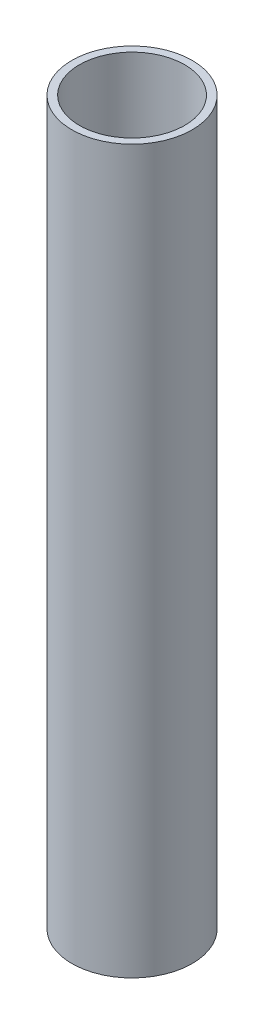
ISO-10303-21;
HEADER;
FILE_DESCRIPTION(('STEP AP214'),'2;1');
FILE_NAME('part.step','',(''),(''),'','','');
FILE_SCHEMA(('AUTOMOTIVE_DESIGN { 1 0 10303 214 1 1 1 1 }'));
ENDSEC;
DATA;
#1=APPLICATION_CONTEXT('core data for automotive mechanical design processes');
#2=APPLICATION_PROTOCOL_DEFINITION('international standard','automotive_design',2000,#1);
#3=PRODUCT_CONTEXT('',#1,'mechanical');
#4=PRODUCT('Part','Part','',(#3));
#5=PRODUCT_RELATED_PRODUCT_CATEGORY('part','',(#4));
#6=PRODUCT_DEFINITION_FORMATION('','',#4);
#7=PRODUCT_DEFINITION_CONTEXT('part definition',#1,'design');
#8=PRODUCT_DEFINITION('design','',#6,#7);
#9=PRODUCT_DEFINITION_SHAPE('','',#8);
#10=(LENGTH_UNIT() NAMED_UNIT(*) SI_UNIT(.MILLI.,.METRE.));
#11=(NAMED_UNIT(*) PLANE_ANGLE_UNIT() SI_UNIT($,.RADIAN.));
#12=(NAMED_UNIT(*) SI_UNIT($,.STERADIAN.) SOLID_ANGLE_UNIT());
#13=UNCERTAINTY_MEASURE_WITH_UNIT(LENGTH_MEASURE(1.E-05),#10,'distance_accuracy_value','');
#14=(GEOMETRIC_REPRESENTATION_CONTEXT(3) GLOBAL_UNCERTAINTY_ASSIGNED_CONTEXT((#13)) GLOBAL_UNIT_ASSIGNED_CONTEXT((#10,
#11,#12)) REPRESENTATION_CONTEXT('',''));
#15=CARTESIAN_POINT('',(0.,0.,0.));
#16=DIRECTION('',(0.,0.,1.));
#17=DIRECTION('',(1.,0.,0.));
#18=AXIS2_PLACEMENT_3D('',#15,#16,#17);
#19=CARTESIAN_POINT('',(0.,304.8,0.));
#20=DIRECTION('',(0.,1.,0.));
#21=DIRECTION('',(0.,0.,1.));
#22=AXIS2_PLACEMENT_3D('',#19,#20,#21);
#23=PLANE('',#22);
#24=CARTESIAN_POINT('',(0.,304.8,0.));
#25=DIRECTION('',(0.,1.,0.));
#26=DIRECTION('',(0.,0.,1.));
#27=AXIS2_PLACEMENT_3D('',#24,#25,#26);
#28=CIRCLE('',#27,25.4);
#29=CARTESIAN_POINT('',(0.,304.8,-25.4));
#30=VERTEX_POINT('',#29);
#31=EDGE_CURVE('E10',#30,#30,#28,.T.);
#32=ORIENTED_EDGE('',*,*,#31,.T.);
#33=EDGE_LOOP('',(#32));
#34=FACE_BOUND('',#33,.T.);
#35=CARTESIAN_POINT('',(0.,304.8,0.));
#36=DIRECTION('',(0.,1.,0.));
#37=DIRECTION('',(0.,0.,1.));
#38=AXIS2_PLACEMENT_3D('',#35,#36,#37);
#39=CIRCLE('',#38,22.225);
#40=CARTESIAN_POINT('',(0.,304.8,-22.225));
#41=VERTEX_POINT('',#40);
#42=EDGE_CURVE('E43',#41,#41,#39,.T.);
#43=ORIENTED_EDGE('',*,*,#42,.F.);
#44=EDGE_LOOP('',(#43));
#45=FACE_BOUND('',#44,.T.);
#46=ADVANCED_FACE('F32',(#34,#45),#23,.T.);
#47=CARTESIAN_POINT('',(0.,0.,0.));
#48=DIRECTION('',(0.,1.,0.));
#49=DIRECTION('',(0.,0.,1.));
#50=AXIS2_PLACEMENT_3D('',#47,#48,#49);
#51=PLANE('',#50);
#52=CARTESIAN_POINT('',(0.,0.,0.));
#53=DIRECTION('',(0.,1.,0.));
#54=DIRECTION('',(0.,0.,1.));
#55=AXIS2_PLACEMENT_3D('',#52,#53,#54);
#56=CIRCLE('',#55,25.4);
#57=CARTESIAN_POINT('',(0.,0.,-25.4));
#58=VERTEX_POINT('',#57);
#59=EDGE_CURVE('E36',#58,#58,#56,.T.);
#60=ORIENTED_EDGE('',*,*,#59,.F.);
#61=EDGE_LOOP('',(#60));
#62=FACE_BOUND('',#61,.T.);
#63=CARTESIAN_POINT('',(0.,0.,0.));
#64=DIRECTION('',(0.,1.,0.));
#65=DIRECTION('',(0.,0.,1.));
#66=AXIS2_PLACEMENT_3D('',#63,#64,#65);
#67=CIRCLE('',#66,22.225);
#68=CARTESIAN_POINT('',(0.,0.,-22.225));
#69=VERTEX_POINT('',#68);
#70=EDGE_CURVE('E45',#69,#69,#67,.T.);
#71=ORIENTED_EDGE('',*,*,#70,.T.);
#72=EDGE_LOOP('',(#71));
#73=FACE_BOUND('',#72,.T.);
#74=ADVANCED_FACE('F55',(#62,#73),#51,.F.);
#75=CARTESIAN_POINT('',(0.,304.8,0.));
#76=DIRECTION('',(0.,-1.,0.));
#77=DIRECTION('',(0.,0.,-1.));
#78=AXIS2_PLACEMENT_3D('',#75,#76,#77);
#79=CYLINDRICAL_SURFACE('',#78,25.4);
#80=CARTESIAN_POINT('',(0.,304.8,-25.4));
#81=CARTESIAN_POINT('',(0.,301.625,-25.4));
#82=CARTESIAN_POINT('',(0.,298.45,-25.4));
#83=CARTESIAN_POINT('',(0.,292.1,-25.4));
#84=CARTESIAN_POINT('',(0.,288.925,-25.4));
#85=CARTESIAN_POINT('',(0.,282.575,-25.4));
#86=CARTESIAN_POINT('',(0.,279.4,-25.4));
#87=CARTESIAN_POINT('',(0.,273.05,-25.4));
#88=CARTESIAN_POINT('',(0.,269.875,-25.4));
#89=CARTESIAN_POINT('',(0.,263.525,-25.4));
#90=CARTESIAN_POINT('',(0.,260.35,-25.4));
#91=CARTESIAN_POINT('',(0.,254.,-25.4));
#92=CARTESIAN_POINT('',(0.,250.825,-25.4));
#93=CARTESIAN_POINT('',(0.,244.475,-25.4));
#94=CARTESIAN_POINT('',(0.,241.3,-25.4));
#95=CARTESIAN_POINT('',(0.,234.95,-25.4));
#96=CARTESIAN_POINT('',(0.,231.775,-25.4));
#97=CARTESIAN_POINT('',(0.,225.425,-25.4));
#98=CARTESIAN_POINT('',(0.,222.25,-25.4));
#99=CARTESIAN_POINT('',(0.,215.9,-25.4));
#100=CARTESIAN_POINT('',(0.,212.725,-25.4));
#101=CARTESIAN_POINT('',(0.,206.375,-25.4));
#102=CARTESIAN_POINT('',(0.,203.2,-25.4));
#103=CARTESIAN_POINT('',(0.,196.85,-25.4));
#104=CARTESIAN_POINT('',(0.,193.675,-25.4));
#105=CARTESIAN_POINT('',(0.,187.325,-25.4));
#106=CARTESIAN_POINT('',(0.,184.15,-25.4));
#107=CARTESIAN_POINT('',(0.,177.8,-25.4));
#108=CARTESIAN_POINT('',(0.,174.625,-25.4));
#109=CARTESIAN_POINT('',(0.,168.275,-25.4));
#110=CARTESIAN_POINT('',(0.,165.1,-25.4));
#111=CARTESIAN_POINT('',(0.,158.75,-25.4));
#112=CARTESIAN_POINT('',(0.,155.575,-25.4));
#113=CARTESIAN_POINT('',(0.,149.225,-25.4));
#114=CARTESIAN_POINT('',(0.,146.05,-25.4));
#115=CARTESIAN_POINT('',(0.,139.7,-25.4));
#116=CARTESIAN_POINT('',(0.,136.525,-25.4));
#117=CARTESIAN_POINT('',(0.,130.175,-25.4));
#118=CARTESIAN_POINT('',(0.,127.,-25.4));
#119=CARTESIAN_POINT('',(0.,120.65,-25.4));
#120=CARTESIAN_POINT('',(0.,117.475,-25.4));
#121=CARTESIAN_POINT('',(0.,111.125,-25.4));
#122=CARTESIAN_POINT('',(0.,107.95,-25.4));
#123=CARTESIAN_POINT('',(0.,101.6,-25.4));
#124=CARTESIAN_POINT('',(0.,98.425,-25.4));
#125=CARTESIAN_POINT('',(0.,92.075,-25.4));
#126=CARTESIAN_POINT('',(0.,88.9,-25.4));
#127=CARTESIAN_POINT('',(0.,82.55,-25.4));
#128=CARTESIAN_POINT('',(0.,79.375,-25.4));
#129=CARTESIAN_POINT('',(0.,73.025,-25.4));
#130=CARTESIAN_POINT('',(0.,69.85,-25.4));
#131=CARTESIAN_POINT('',(0.,63.5,-25.4));
#132=CARTESIAN_POINT('',(0.,60.325,-25.4));
#133=CARTESIAN_POINT('',(0.,53.975,-25.4));
#134=CARTESIAN_POINT('',(0.,50.8,-25.4));
#135=CARTESIAN_POINT('',(0.,44.45,-25.4));
#136=CARTESIAN_POINT('',(0.,41.275,-25.4));
#137=CARTESIAN_POINT('',(0.,34.925,-25.4));
#138=CARTESIAN_POINT('',(0.,31.75,-25.4));
#139=CARTESIAN_POINT('',(0.,25.4,-25.4));
#140=CARTESIAN_POINT('',(0.,22.225,-25.4));
#141=CARTESIAN_POINT('',(0.,15.875,-25.4));
#142=CARTESIAN_POINT('',(0.,12.7,-25.4));
#143=CARTESIAN_POINT('',(0.,6.35,-25.4));
#144=CARTESIAN_POINT('',(0.,3.175,-25.4));
#145=CARTESIAN_POINT('',(0.,0.,-25.4));
#146=B_SPLINE_CURVE_WITH_KNOTS('',3,(#80,#81,#82,#83,#84,#85,#86,#87,#88,#89,#90,#91,#92,#93,
#94,#95,#96,#97,#98,#99,#100,#101,#102,#103,#104,#105,#106,#107,#108,#109,#110,#111,#112,#113,
#114,#115,#116,#117,#118,#119,#120,#121,#122,#123,#124,#125,#126,#127,#128,#129,#130,#131,#132,
#133,#134,#135,#136,#137,#138,#139,#140,#141,#142,#143,#144,#145),.UNSPECIFIED.,.F.,.F.,(4,2,2,
2,2,2,2,2,2,2,2,2,2,2,2,2,2,2,2,2,2,2,2,2,2,2,2,2,2,2,2,2,4),(0.,9.52499999999995,19.05,28.575,
38.1,47.625,57.15,66.675,76.2,85.725,95.2499999999999,104.775,114.3,123.825,133.35,142.875,
152.4,161.925,171.45,180.975,190.5,200.025,209.55,219.075,228.6,238.125,247.65,257.175,266.7,
276.225,285.75,295.275,304.8),.UNSPECIFIED.);
#147=EDGE_CURVE('BSEAM34',#30,#58,#146,.T.);
#148=ORIENTED_EDGE('',*,*,#31,.F.);
#149=ORIENTED_EDGE('',*,*,#59,.T.);
#150=ORIENTED_EDGE('',*,*,#147,.T.);
#151=ORIENTED_EDGE('',*,*,#147,.F.);
#152=EDGE_LOOP('',(#148,#150,#149,#151));
#153=FACE_BOUND('',#152,.T.);
#154=ADVANCED_FACE('F34',(#153),#79,.T.);
#155=CARTESIAN_POINT('',(0.,304.8,0.));
#156=DIRECTION('',(0.,-1.,0.));
#157=DIRECTION('',(0.,0.,-1.));
#158=AXIS2_PLACEMENT_3D('',#155,#156,#157);
#159=CYLINDRICAL_SURFACE('',#158,22.225);
#160=CARTESIAN_POINT('',(0.,304.8,-22.225));
#161=CARTESIAN_POINT('',(0.,301.625,-22.225));
#162=CARTESIAN_POINT('',(0.,298.45,-22.225));
#163=CARTESIAN_POINT('',(0.,292.1,-22.225));
#164=CARTESIAN_POINT('',(0.,288.925,-22.225));
#165=CARTESIAN_POINT('',(0.,282.575,-22.225));
#166=CARTESIAN_POINT('',(0.,279.4,-22.225));
#167=CARTESIAN_POINT('',(0.,273.05,-22.225));
#168=CARTESIAN_POINT('',(0.,269.875,-22.225));
#169=CARTESIAN_POINT('',(0.,263.525,-22.225));
#170=CARTESIAN_POINT('',(0.,260.35,-22.225));
#171=CARTESIAN_POINT('',(0.,254.,-22.225));
#172=CARTESIAN_POINT('',(0.,250.825,-22.225));
#173=CARTESIAN_POINT('',(0.,244.475,-22.225));
#174=CARTESIAN_POINT('',(0.,241.3,-22.225));
#175=CARTESIAN_POINT('',(0.,234.95,-22.225));
#176=CARTESIAN_POINT('',(0.,231.775,-22.225));
#177=CARTESIAN_POINT('',(0.,225.425,-22.225));
#178=CARTESIAN_POINT('',(0.,222.25,-22.225));
#179=CARTESIAN_POINT('',(0.,215.9,-22.225));
#180=CARTESIAN_POINT('',(0.,212.725,-22.225));
#181=CARTESIAN_POINT('',(0.,206.375,-22.225));
#182=CARTESIAN_POINT('',(0.,203.2,-22.225));
#183=CARTESIAN_POINT('',(0.,196.85,-22.225));
#184=CARTESIAN_POINT('',(0.,193.675,-22.225));
#185=CARTESIAN_POINT('',(0.,187.325,-22.225));
#186=CARTESIAN_POINT('',(0.,184.15,-22.225));
#187=CARTESIAN_POINT('',(0.,177.8,-22.225));
#188=CARTESIAN_POINT('',(0.,174.625,-22.225));
#189=CARTESIAN_POINT('',(0.,168.275,-22.225));
#190=CARTESIAN_POINT('',(0.,165.1,-22.225));
#191=CARTESIAN_POINT('',(0.,158.75,-22.225));
#192=CARTESIAN_POINT('',(0.,155.575,-22.225));
#193=CARTESIAN_POINT('',(0.,149.225,-22.225));
#194=CARTESIAN_POINT('',(0.,146.05,-22.225));
#195=CARTESIAN_POINT('',(0.,139.7,-22.225));
#196=CARTESIAN_POINT('',(0.,136.525,-22.225));
#197=CARTESIAN_POINT('',(0.,130.175,-22.225));
#198=CARTESIAN_POINT('',(0.,127.,-22.225));
#199=CARTESIAN_POINT('',(0.,120.65,-22.225));
#200=CARTESIAN_POINT('',(0.,117.475,-22.225));
#201=CARTESIAN_POINT('',(0.,111.125,-22.225));
#202=CARTESIAN_POINT('',(0.,107.95,-22.225));
#203=CARTESIAN_POINT('',(0.,101.6,-22.225));
#204=CARTESIAN_POINT('',(0.,98.425,-22.225));
#205=CARTESIAN_POINT('',(0.,92.075,-22.225));
#206=CARTESIAN_POINT('',(0.,88.9,-22.225));
#207=CARTESIAN_POINT('',(0.,82.55,-22.225));
#208=CARTESIAN_POINT('',(0.,79.375,-22.225));
#209=CARTESIAN_POINT('',(0.,73.025,-22.225));
#210=CARTESIAN_POINT('',(0.,69.85,-22.225));
#211=CARTESIAN_POINT('',(0.,63.5,-22.225));
#212=CARTESIAN_POINT('',(0.,60.325,-22.225));
#213=CARTESIAN_POINT('',(0.,53.975,-22.225));
#214=CARTESIAN_POINT('',(0.,50.8,-22.225));
#215=CARTESIAN_POINT('',(0.,44.45,-22.225));
#216=CARTESIAN_POINT('',(0.,41.275,-22.225));
#217=CARTESIAN_POINT('',(0.,34.925,-22.225));
#218=CARTESIAN_POINT('',(0.,31.75,-22.225));
#219=CARTESIAN_POINT('',(0.,25.4,-22.225));
#220=CARTESIAN_POINT('',(0.,22.225,-22.225));
#221=CARTESIAN_POINT('',(0.,15.875,-22.225));
#222=CARTESIAN_POINT('',(0.,12.7,-22.225));
#223=CARTESIAN_POINT('',(0.,6.35,-22.225));
#224=CARTESIAN_POINT('',(0.,3.175,-22.225));
#225=CARTESIAN_POINT('',(0.,0.,-22.225));
#226=B_SPLINE_CURVE_WITH_KNOTS('',3,(#160,#161,#162,#163,#164,#165,#166,#167,#168,#169,#170,
#171,#172,#173,#174,#175,#176,#177,#178,#179,#180,#181,#182,#183,#184,#185,#186,#187,#188,#189,
#190,#191,#192,#193,#194,#195,#196,#197,#198,#199,#200,#201,#202,#203,#204,#205,#206,#207,#208,
#209,#210,#211,#212,#213,#214,#215,#216,#217,#218,#219,#220,#221,#222,#223,#224,#225),
.UNSPECIFIED.,.F.,.F.,(4,2,2,2,2,2,2,2,2,2,2,2,2,2,2,2,2,2,2,2,2,2,2,2,2,2,2,2,2,2,2,2,4),(0.,
9.52500000000001,19.05,28.575,38.1,47.625,57.15,66.675,76.2,85.7250000000001,95.2500000000001,
104.775,114.3,123.825,133.35,142.875,152.4,161.925,171.45,180.975,190.5,200.025,209.55,219.075,
228.6,238.125,247.65,257.175,266.7,276.225,285.75,295.275,304.8),.UNSPECIFIED.);
#227=EDGE_CURVE('BSEAM51',#41,#69,#226,.T.);
#228=ORIENTED_EDGE('',*,*,#42,.T.);
#229=ORIENTED_EDGE('',*,*,#70,.F.);
#230=ORIENTED_EDGE('',*,*,#227,.T.);
#231=ORIENTED_EDGE('',*,*,#227,.F.);
#232=EDGE_LOOP('',(#228,#230,#229,#231));
#233=FACE_BOUND('',#232,.T.);
#234=ADVANCED_FACE('F51',(#233),#159,.F.);
#235=CLOSED_SHELL('',(#46,#74,#154,#234));
#236=MANIFOLD_SOLID_BREP('B2',#235);
#237=ADVANCED_BREP_SHAPE_REPRESENTATION('',(#18,#236),#14);
#238=SHAPE_DEFINITION_REPRESENTATION(#9,#237);
ENDSEC;
END-ISO-10303-21;
